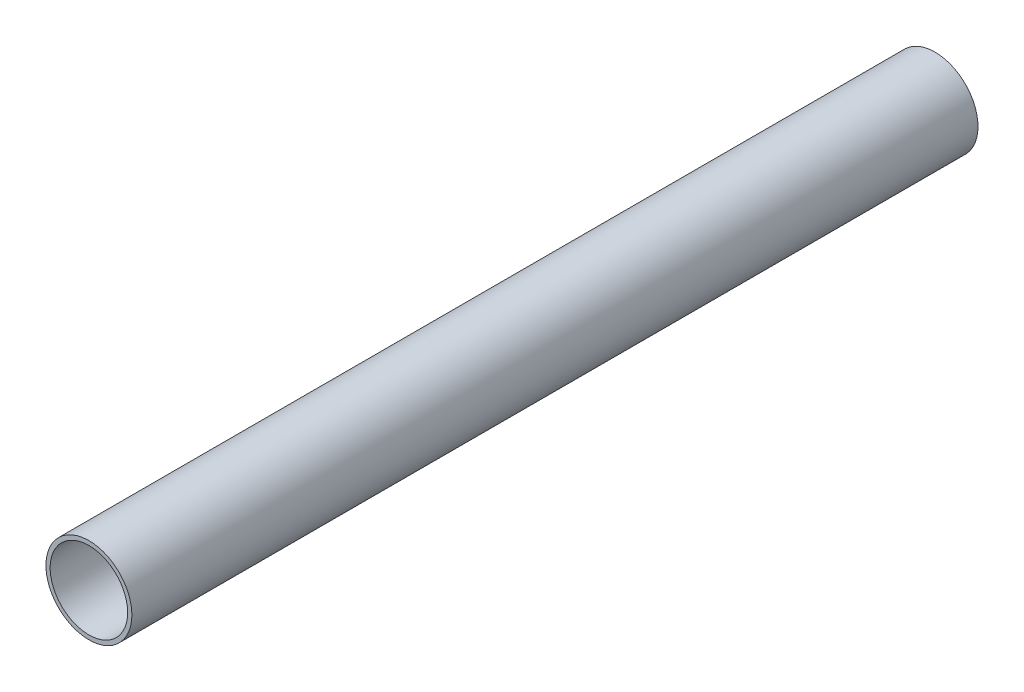
ISO-10303-21;
HEADER;
FILE_DESCRIPTION(('STEP AP214'),'2;1');
FILE_NAME('part.step','',(''),(''),'','','');
FILE_SCHEMA(('AUTOMOTIVE_DESIGN { 1 0 10303 214 1 1 1 1 }'));
ENDSEC;
DATA;
#1=APPLICATION_CONTEXT('core data for automotive mechanical design processes');
#2=APPLICATION_PROTOCOL_DEFINITION('international standard','automotive_design',2000,#1);
#3=PRODUCT_CONTEXT('',#1,'mechanical');
#4=PRODUCT('Part','Part','',(#3));
#5=PRODUCT_RELATED_PRODUCT_CATEGORY('part','',(#4));
#6=PRODUCT_DEFINITION_FORMATION('','',#4);
#7=PRODUCT_DEFINITION_CONTEXT('part definition',#1,'design');
#8=PRODUCT_DEFINITION('design','',#6,#7);
#9=PRODUCT_DEFINITION_SHAPE('','',#8);
#10=(LENGTH_UNIT() NAMED_UNIT(*) SI_UNIT(.MILLI.,.METRE.));
#11=(NAMED_UNIT(*) PLANE_ANGLE_UNIT() SI_UNIT($,.RADIAN.));
#12=(NAMED_UNIT(*) SI_UNIT($,.STERADIAN.) SOLID_ANGLE_UNIT());
#13=UNCERTAINTY_MEASURE_WITH_UNIT(LENGTH_MEASURE(1.E-05),#10,'distance_accuracy_value','');
#14=(GEOMETRIC_REPRESENTATION_CONTEXT(3) GLOBAL_UNCERTAINTY_ASSIGNED_CONTEXT((#13)) GLOBAL_UNIT_ASSIGNED_CONTEXT((#10,
#11,#12)) REPRESENTATION_CONTEXT('',''));
#15=CARTESIAN_POINT('',(0.,0.,0.));
#16=DIRECTION('',(0.,0.,1.));
#17=DIRECTION('',(1.,0.,0.));
#18=AXIS2_PLACEMENT_3D('',#15,#16,#17);
#19=CARTESIAN_POINT('',(0.,0.,2000.));
#20=DIRECTION('',(0.,0.,1.));
#21=DIRECTION('',(1.,0.,0.));
#22=AXIS2_PLACEMENT_3D('',#19,#20,#21);
#23=PLANE('',#22);
#24=CARTESIAN_POINT('',(0.,0.,2000.));
#25=DIRECTION('',(0.,0.,1.));
#26=DIRECTION('',(1.,0.,0.));
#27=AXIS2_PLACEMENT_3D('',#24,#25,#26);
#28=CIRCLE('',#27,101.6);
#29=CARTESIAN_POINT('',(101.6,0.,2000.));
#30=VERTEX_POINT('',#29);
#31=EDGE_CURVE('E10',#30,#30,#28,.T.);
#32=ORIENTED_EDGE('',*,*,#31,.T.);
#33=EDGE_LOOP('',(#32));
#34=FACE_BOUND('',#33,.T.);
#35=CARTESIAN_POINT('',(0.,0.,2000.));
#36=DIRECTION('',(0.,0.,1.));
#37=DIRECTION('',(1.,0.,0.));
#38=AXIS2_PLACEMENT_3D('',#35,#36,#37);
#39=CIRCLE('',#38,91.6);
#40=CARTESIAN_POINT('',(91.6,0.,2000.));
#41=VERTEX_POINT('',#40);
#42=EDGE_CURVE('E46',#41,#41,#39,.T.);
#43=ORIENTED_EDGE('',*,*,#42,.F.);
#44=EDGE_LOOP('',(#43));
#45=FACE_BOUND('',#44,.T.);
#46=ADVANCED_FACE('F35',(#34,#45),#23,.T.);
#47=CARTESIAN_POINT('',(0.,0.,0.));
#48=DIRECTION('',(0.,0.,1.));
#49=DIRECTION('',(1.,0.,0.));
#50=AXIS2_PLACEMENT_3D('',#47,#48,#49);
#51=PLANE('',#50);
#52=CARTESIAN_POINT('',(0.,0.,0.));
#53=DIRECTION('',(0.,0.,1.));
#54=DIRECTION('',(1.,0.,0.));
#55=AXIS2_PLACEMENT_3D('',#52,#53,#54);
#56=CIRCLE('',#55,101.6);
#57=CARTESIAN_POINT('',(101.6,0.,0.));
#58=VERTEX_POINT('',#57);
#59=EDGE_CURVE('E39',#58,#58,#56,.T.);
#60=ORIENTED_EDGE('',*,*,#59,.F.);
#61=EDGE_LOOP('',(#60));
#62=FACE_BOUND('',#61,.T.);
#63=CARTESIAN_POINT('',(0.,0.,0.));
#64=DIRECTION('',(0.,0.,1.));
#65=DIRECTION('',(1.,0.,0.));
#66=AXIS2_PLACEMENT_3D('',#63,#64,#65);
#67=CIRCLE('',#66,91.6);
#68=CARTESIAN_POINT('',(91.6,0.,0.));
#69=VERTEX_POINT('',#68);
#70=EDGE_CURVE('E48',#69,#69,#67,.T.);
#71=ORIENTED_EDGE('',*,*,#70,.T.);
#72=EDGE_LOOP('',(#71));
#73=FACE_BOUND('',#72,.T.);
#74=ADVANCED_FACE('F58',(#62,#73),#51,.F.);
#75=CARTESIAN_POINT('',(0.,0.,2000.));
#76=DIRECTION('',(0.,0.,-1.));
#77=DIRECTION('',(-1.,0.,0.));
#78=AXIS2_PLACEMENT_3D('',#75,#76,#77);
#79=CYLINDRICAL_SURFACE('',#78,101.6);
#80=ORIENTED_EDGE('',*,*,#31,.F.);
#81=EDGE_LOOP('',(#80));
#82=FACE_BOUND('',#81,.T.);
#83=ORIENTED_EDGE('',*,*,#59,.T.);
#84=EDGE_LOOP('',(#83));
#85=FACE_BOUND('',#84,.T.);
#86=ADVANCED_FACE('F37',(#82,#85),#79,.T.);
#87=CARTESIAN_POINT('',(0.,0.,2000.));
#88=DIRECTION('',(0.,0.,-1.));
#89=DIRECTION('',(-1.,0.,0.));
#90=AXIS2_PLACEMENT_3D('',#87,#88,#89);
#91=CYLINDRICAL_SURFACE('',#90,91.6);
#92=ORIENTED_EDGE('',*,*,#42,.T.);
#93=EDGE_LOOP('',(#92));
#94=FACE_BOUND('',#93,.T.);
#95=ORIENTED_EDGE('',*,*,#70,.F.);
#96=EDGE_LOOP('',(#95));
#97=FACE_BOUND('',#96,.T.);
#98=ADVANCED_FACE('F54',(#94,#97),#91,.F.);
#99=CLOSED_SHELL('',(#46,#74,#86,#98));
#100=MANIFOLD_SOLID_BREP('B2',#99);
#101=ADVANCED_BREP_SHAPE_REPRESENTATION('',(#18,#100),#14);
#102=SHAPE_DEFINITION_REPRESENTATION(#9,#101);
ENDSEC;
END-ISO-10303-21;
